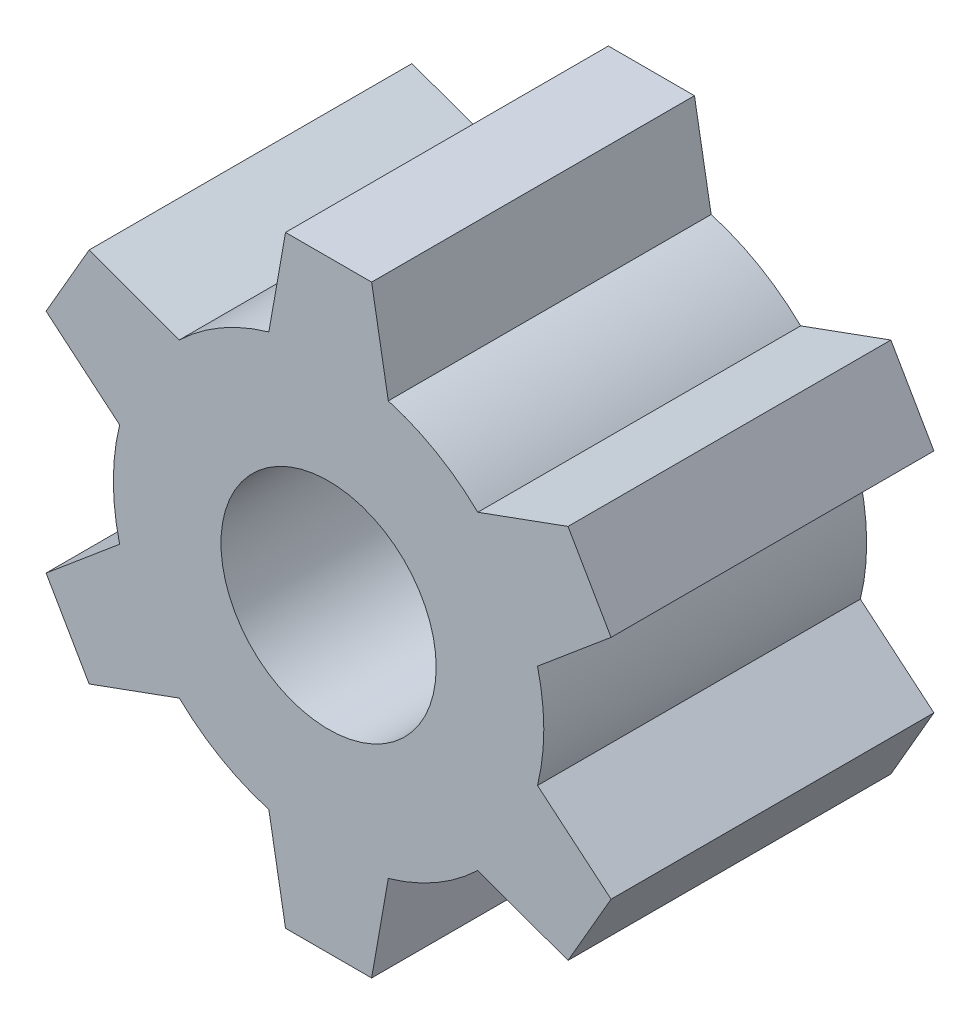
ISO-10303-21;
HEADER;
FILE_DESCRIPTION(('STEP AP214'),'2;1');
FILE_NAME('part.step','',(''),(''),'','','');
FILE_SCHEMA(('AUTOMOTIVE_DESIGN { 1 0 10303 214 1 1 1 1 }'));
ENDSEC;
DATA;
#1=APPLICATION_CONTEXT('core data for automotive mechanical design processes');
#2=APPLICATION_PROTOCOL_DEFINITION('international standard','automotive_design',2000,#1);
#3=PRODUCT_CONTEXT('',#1,'mechanical');
#4=PRODUCT('Part','Part','',(#3));
#5=PRODUCT_RELATED_PRODUCT_CATEGORY('part','',(#4));
#6=PRODUCT_DEFINITION_FORMATION('','',#4);
#7=PRODUCT_DEFINITION_CONTEXT('part definition',#1,'design');
#8=PRODUCT_DEFINITION('design','',#6,#7);
#9=PRODUCT_DEFINITION_SHAPE('','',#8);
#10=(LENGTH_UNIT() NAMED_UNIT(*) SI_UNIT(.MILLI.,.METRE.));
#11=(NAMED_UNIT(*) PLANE_ANGLE_UNIT() SI_UNIT($,.RADIAN.));
#12=(NAMED_UNIT(*) SI_UNIT($,.STERADIAN.) SOLID_ANGLE_UNIT());
#13=UNCERTAINTY_MEASURE_WITH_UNIT(LENGTH_MEASURE(1.E-05),#10,'distance_accuracy_value','');
#14=(GEOMETRIC_REPRESENTATION_CONTEXT(3) GLOBAL_UNCERTAINTY_ASSIGNED_CONTEXT((#13)) GLOBAL_UNIT_ASSIGNED_CONTEXT((#10,
#11,#12)) REPRESENTATION_CONTEXT('',''));
#15=CARTESIAN_POINT('',(0.,0.,0.));
#16=DIRECTION('',(0.,0.,1.));
#17=DIRECTION('',(1.,0.,0.));
#18=AXIS2_PLACEMENT_3D('',#15,#16,#17);
#19=CARTESIAN_POINT('',(0.,0.,7.5));
#20=DIRECTION('',(0.,0.,1.));
#21=DIRECTION('',(1.,0.,0.));
#22=AXIS2_PLACEMENT_3D('',#19,#20,#21);
#23=PLANE('',#22);
#24=DIRECTION('',(0.766102096423628,0.642718894895212,0.));
#25=VECTOR('',#24,1.);
#26=CARTESIAN_POINT('',(6.56217782649117,2.6339745962162,7.5));
#27=LINE('',#26,#25);
#28=CARTESIAN_POINT('',(4.85370252744986,1.20065472764819,7.5));
#29=VERTEX_POINT('',#28);
#30=CARTESIAN_POINT('',(6.56217782649117,2.6339745962162,7.5));
#31=VERTEX_POINT('',#30);
#32=EDGE_CURVE('E279',#29,#31,#27,.T.);
#33=ORIENTED_EDGE('',*,*,#32,.T.);
#34=DIRECTION('',(-0.499999999999999,0.866025403784439,0.));
#35=VECTOR('',#34,1.);
#36=CARTESIAN_POINT('',(5.56217782649126,4.36602540378491,7.5));
#37=LINE('',#36,#35);
#38=CARTESIAN_POINT('',(5.56217782649126,4.36602540378491,7.5));
#39=VERTEX_POINT('',#38);
#40=EDGE_CURVE('E147',#31,#39,#37,.T.);
#41=ORIENTED_EDGE('',*,*,#40,.T.);
#42=DIRECTION('',(-0.939661938683348,-0.342104429947715,0.));
#43=VECTOR('',#42,1.);
#44=CARTESIAN_POINT('',(5.56217782649126,4.36602540378491,7.5));
#45=LINE('',#44,#43);
#46=CARTESIAN_POINT('',(3.4666487590414,3.60310232736095,7.5));
#47=VERTEX_POINT('',#46);
#48=EDGE_CURVE('E342',#39,#47,#45,.T.);
#49=ORIENTED_EDGE('',*,*,#48,.T.);
#50=CARTESIAN_POINT('',(0.,0.,7.5));
#51=DIRECTION('',(0.,0.,1.));
#52=DIRECTION('',(1.,0.,0.));
#53=AXIS2_PLACEMENT_3D('',#50,#51,#52);
#54=CIRCLE('',#53,4.99999999999972);
#55=CARTESIAN_POINT('',(1.38705376840771,4.80375705500842,7.5));
#56=VERTEX_POINT('',#55);
#57=EDGE_CURVE('E361',#47,#56,#54,.T.);
#58=ORIENTED_EDGE('',*,*,#57,.T.);
#59=DIRECTION('',(-0.1735598422597,0.984823324842983,0.));
#60=VECTOR('',#59,1.);
#61=CARTESIAN_POINT('',(0.999999999999492,7.0000000000004,7.5));
#62=LINE('',#61,#60);
#63=CARTESIAN_POINT('',(0.999999999999492,7.0000000000004,7.5));
#64=VERTEX_POINT('',#63);
#65=EDGE_CURVE('E358',#56,#64,#62,.T.);
#66=ORIENTED_EDGE('',*,*,#65,.T.);
#67=DIRECTION('',(-1.,0.,0.));
#68=VECTOR('',#67,1.);
#69=CARTESIAN_POINT('',(-1.00000000000031,7.00000000000041,7.5));
#70=LINE('',#69,#68);
#71=CARTESIAN_POINT('',(-1.00000000000031,7.00000000000041,7.5));
#72=VERTEX_POINT('',#71);
#73=EDGE_CURVE('E360',#64,#72,#70,.T.);
#74=ORIENTED_EDGE('',*,*,#73,.T.);
#75=DIRECTION('',(-0.173559842259759,-0.984823324842973,0.));
#76=VECTOR('',#75,1.);
#77=CARTESIAN_POINT('',(-1.00000000000031,7.00000000000041,7.5));
#78=LINE('',#77,#76);
#79=CARTESIAN_POINT('',(-1.38705376840872,4.80375705500813,7.5));
#80=VERTEX_POINT('',#79);
#81=EDGE_CURVE('E363',#72,#80,#78,.T.);
#82=ORIENTED_EDGE('',*,*,#81,.T.);
#83=CARTESIAN_POINT('',(0.,0.,7.5));
#84=DIRECTION('',(0.,0.,1.));
#85=DIRECTION('',(1.,0.,0.));
#86=AXIS2_PLACEMENT_3D('',#83,#84,#85);
#87=CIRCLE('',#86,4.99999999999972);
#88=CARTESIAN_POINT('',(-3.46664875904215,3.60310232736022,7.5));
#89=VERTEX_POINT('',#88);
#90=EDGE_CURVE('E369',#80,#89,#87,.T.);
#91=ORIENTED_EDGE('',*,*,#90,.T.);
#92=DIRECTION('',(-0.939661938683328,0.34210442994777,0.));
#93=VECTOR('',#92,1.);
#94=CARTESIAN_POINT('',(-5.56217782649168,4.3660254037842,7.5));
#95=LINE('',#94,#93);
#96=CARTESIAN_POINT('',(-5.56217782649168,4.3660254037842,7.5));
#97=VERTEX_POINT('',#96);
#98=EDGE_CURVE('E371',#89,#97,#95,.T.);
#99=ORIENTED_EDGE('',*,*,#98,.T.);
#100=DIRECTION('',(-0.500000000000001,-0.866025403784438,0.));
#101=VECTOR('',#100,1.);
#102=CARTESIAN_POINT('',(-6.56217782649158,2.63397459621549,7.5));
#103=LINE('',#102,#101);
#104=CARTESIAN_POINT('',(-6.56217782649158,2.63397459621549,7.5));
#105=VERTEX_POINT('',#104);
#106=EDGE_CURVE('E373',#97,#105,#103,.T.);
#107=ORIENTED_EDGE('',*,*,#106,.T.);
#108=DIRECTION('',(0.76610209642359,-0.642718894895257,0.));
#109=VECTOR('',#108,1.);
#110=CARTESIAN_POINT('',(-6.56217782649158,2.63397459621549,7.5));
#111=LINE('',#110,#109);
#112=CARTESIAN_POINT('',(-4.85370252745012,1.20065472764717,7.5));
#113=VERTEX_POINT('',#112);
#114=EDGE_CURVE('E375',#105,#113,#111,.T.);
#115=ORIENTED_EDGE('',*,*,#114,.T.);
#116=CARTESIAN_POINT('',(0.,0.,7.5));
#117=DIRECTION('',(0.,0.,1.));
#118=DIRECTION('',(1.,0.,0.));
#119=AXIS2_PLACEMENT_3D('',#116,#117,#118);
#120=CIRCLE('',#119,4.99999999999972);
#121=CARTESIAN_POINT('',(-4.85370252744987,-1.20065472764819,7.5));
#122=VERTEX_POINT('',#121);
#123=EDGE_CURVE('E377',#113,#122,#120,.T.);
#124=ORIENTED_EDGE('',*,*,#123,.T.);
#125=DIRECTION('',(-0.766102096423627,-0.642718894895212,0.));
#126=VECTOR('',#125,1.);
#127=CARTESIAN_POINT('',(-6.56217782649117,-2.6339745962162,7.5));
#128=LINE('',#127,#126);
#129=CARTESIAN_POINT('',(-6.56217782649117,-2.6339745962162,7.5));
#130=VERTEX_POINT('',#129);
#131=EDGE_CURVE('E379',#122,#130,#128,.T.);
#132=ORIENTED_EDGE('',*,*,#131,.T.);
#133=DIRECTION('',(0.499999999999999,-0.866025403784439,0.));
#134=VECTOR('',#133,1.);
#135=CARTESIAN_POINT('',(-5.56217782649126,-4.36602540378492,7.5));
#136=LINE('',#135,#134);
#137=CARTESIAN_POINT('',(-5.56217782649126,-4.36602540378492,7.5));
#138=VERTEX_POINT('',#137);
#139=EDGE_CURVE('E381',#130,#138,#136,.T.);
#140=ORIENTED_EDGE('',*,*,#139,.T.);
#141=DIRECTION('',(0.939661938683348,0.342104429947715,0.));
#142=VECTOR('',#141,1.);
#143=CARTESIAN_POINT('',(-5.56217782649126,-4.36602540378492,7.5));
#144=LINE('',#143,#142);
#145=CARTESIAN_POINT('',(-3.4666487590414,-3.60310232736095,7.5));
#146=VERTEX_POINT('',#145);
#147=EDGE_CURVE('E383',#138,#146,#144,.T.);
#148=ORIENTED_EDGE('',*,*,#147,.T.);
#149=CARTESIAN_POINT('',(0.,0.,7.5));
#150=DIRECTION('',(0.,0.,1.));
#151=DIRECTION('',(1.,0.,0.));
#152=AXIS2_PLACEMENT_3D('',#149,#150,#151);
#153=CIRCLE('',#152,4.99999999999972);
#154=CARTESIAN_POINT('',(-1.38705376840772,-4.80375705500841,7.5));
#155=VERTEX_POINT('',#154);
#156=EDGE_CURVE('E385',#146,#155,#153,.T.);
#157=ORIENTED_EDGE('',*,*,#156,.T.);
#158=DIRECTION('',(0.1735598422597,-0.984823324842983,0.));
#159=VECTOR('',#158,1.);
#160=CARTESIAN_POINT('',(-0.999999999999493,-7.0000000000004,7.5));
#161=LINE('',#160,#159);
#162=CARTESIAN_POINT('',(-0.999999999999493,-7.0000000000004,7.5));
#163=VERTEX_POINT('',#162);
#164=EDGE_CURVE('E387',#155,#163,#161,.T.);
#165=ORIENTED_EDGE('',*,*,#164,.T.);
#166=DIRECTION('',(1.,0.,0.));
#167=VECTOR('',#166,1.);
#168=CARTESIAN_POINT('',(1.00000000000031,-7.00000000000041,7.5));
#169=LINE('',#168,#167);
#170=CARTESIAN_POINT('',(1.00000000000031,-7.00000000000041,7.5));
#171=VERTEX_POINT('',#170);
#172=EDGE_CURVE('E389',#163,#171,#169,.T.);
#173=ORIENTED_EDGE('',*,*,#172,.T.);
#174=DIRECTION('',(0.173559842259759,0.984823324842973,0.));
#175=VECTOR('',#174,1.);
#176=CARTESIAN_POINT('',(1.00000000000031,-7.00000000000041,7.5));
#177=LINE('',#176,#175);
#178=CARTESIAN_POINT('',(1.38705376840872,-4.80375705500812,7.5));
#179=VERTEX_POINT('',#178);
#180=EDGE_CURVE('E391',#171,#179,#177,.T.);
#181=ORIENTED_EDGE('',*,*,#180,.T.);
#182=CARTESIAN_POINT('',(0.,0.,7.5));
#183=DIRECTION('',(0.,0.,1.));
#184=DIRECTION('',(1.,0.,0.));
#185=AXIS2_PLACEMENT_3D('',#182,#183,#184);
#186=CIRCLE('',#185,4.99999999999972);
#187=CARTESIAN_POINT('',(3.46664875904215,-3.60310232736022,7.5));
#188=VERTEX_POINT('',#187);
#189=EDGE_CURVE('E393',#179,#188,#186,.T.);
#190=ORIENTED_EDGE('',*,*,#189,.T.);
#191=DIRECTION('',(0.939661938683328,-0.342104429947771,0.));
#192=VECTOR('',#191,1.);
#193=CARTESIAN_POINT('',(5.56217782649167,-4.3660254037842,7.5));
#194=LINE('',#193,#192);
#195=CARTESIAN_POINT('',(5.56217782649167,-4.3660254037842,7.5));
#196=VERTEX_POINT('',#195);
#197=EDGE_CURVE('E214',#188,#196,#194,.T.);
#198=ORIENTED_EDGE('',*,*,#197,.T.);
#199=DIRECTION('',(0.500000000000001,0.866025403784438,0.));
#200=VECTOR('',#199,1.);
#201=CARTESIAN_POINT('',(6.56217782649158,-2.63397459621549,7.5));
#202=LINE('',#201,#200);
#203=CARTESIAN_POINT('',(6.56217782649158,-2.63397459621549,7.5));
#204=VERTEX_POINT('',#203);
#205=EDGE_CURVE('E208',#196,#204,#202,.T.);
#206=ORIENTED_EDGE('',*,*,#205,.T.);
#207=DIRECTION('',(-0.766102096423589,0.642718894895258,0.));
#208=VECTOR('',#207,1.);
#209=CARTESIAN_POINT('',(6.56217782649158,-2.63397459621549,7.5));
#210=LINE('',#209,#208);
#211=CARTESIAN_POINT('',(4.85370252745012,-1.20065472764717,7.5));
#212=VERTEX_POINT('',#211);
#213=EDGE_CURVE('E212',#204,#212,#210,.T.);
#214=ORIENTED_EDGE('',*,*,#213,.T.);
#215=CARTESIAN_POINT('',(0.,0.,7.5));
#216=DIRECTION('',(0.,0.,1.));
#217=DIRECTION('',(1.,0.,0.));
#218=AXIS2_PLACEMENT_3D('',#215,#216,#217);
#219=CIRCLE('',#218,4.99999999999972);
#220=EDGE_CURVE('E56',#212,#29,#219,.T.);
#221=ORIENTED_EDGE('',*,*,#220,.T.);
#222=EDGE_LOOP('',(#33,#41,#49,#58,#66,#74,#82,#91,#99,#107,#115,#124,#132,#140,#148,#157,#165,
#173,#181,#190,#198,#206,#214,#221));
#223=FACE_BOUND('',#222,.T.);
#224=CARTESIAN_POINT('',(0.,0.,7.5));
#225=DIRECTION('',(0.,0.,1.));
#226=DIRECTION('',(1.,0.,0.));
#227=AXIS2_PLACEMENT_3D('',#224,#225,#226);
#228=CIRCLE('',#227,2.5);
#229=CARTESIAN_POINT('',(2.5,0.,7.5));
#230=VERTEX_POINT('',#229);
#231=EDGE_CURVE('E236',#230,#230,#228,.T.);
#232=ORIENTED_EDGE('',*,*,#231,.F.);
#233=EDGE_LOOP('',(#232));
#234=FACE_BOUND('',#233,.T.);
#235=ADVANCED_FACE('F39',(#223,#234),#23,.T.);
#236=CARTESIAN_POINT('',(0.,0.,0.));
#237=DIRECTION('',(0.,0.,1.));
#238=DIRECTION('',(1.,0.,0.));
#239=AXIS2_PLACEMENT_3D('',#236,#237,#238);
#240=PLANE('',#239);
#241=DIRECTION('',(0.766102096423628,0.642718894895212,0.));
#242=VECTOR('',#241,1.);
#243=CARTESIAN_POINT('',(6.56217782649117,2.6339745962162,0.));
#244=LINE('',#243,#242);
#245=CARTESIAN_POINT('',(4.85370252744986,1.20065472764819,0.));
#246=VERTEX_POINT('',#245);
#247=CARTESIAN_POINT('',(6.56217782649117,2.6339745962162,0.));
#248=VERTEX_POINT('',#247);
#249=EDGE_CURVE('E232',#246,#248,#244,.T.);
#250=ORIENTED_EDGE('',*,*,#249,.F.);
#251=CARTESIAN_POINT('',(0.,0.,0.));
#252=DIRECTION('',(0.,0.,1.));
#253=DIRECTION('',(1.,0.,0.));
#254=AXIS2_PLACEMENT_3D('',#251,#252,#253);
#255=CIRCLE('',#254,4.99999999999972);
#256=CARTESIAN_POINT('',(4.85370252745012,-1.20065472764717,0.));
#257=VERTEX_POINT('',#256);
#258=EDGE_CURVE('E139',#257,#246,#255,.T.);
#259=ORIENTED_EDGE('',*,*,#258,.F.);
#260=DIRECTION('',(-0.766102096423589,0.642718894895258,0.));
#261=VECTOR('',#260,1.);
#262=CARTESIAN_POINT('',(6.56217782649158,-2.63397459621549,0.));
#263=LINE('',#262,#261);
#264=CARTESIAN_POINT('',(6.56217782649158,-2.63397459621549,0.));
#265=VERTEX_POINT('',#264);
#266=EDGE_CURVE('E133',#265,#257,#263,.T.);
#267=ORIENTED_EDGE('',*,*,#266,.F.);
#268=DIRECTION('',(0.500000000000001,0.866025403784438,0.));
#269=VECTOR('',#268,1.);
#270=CARTESIAN_POINT('',(6.56217782649158,-2.63397459621549,0.));
#271=LINE('',#270,#269);
#272=CARTESIAN_POINT('',(5.56217782649167,-4.3660254037842,0.));
#273=VERTEX_POINT('',#272);
#274=EDGE_CURVE('E222',#273,#265,#271,.T.);
#275=ORIENTED_EDGE('',*,*,#274,.F.);
#276=DIRECTION('',(0.939661938683328,-0.342104429947771,0.));
#277=VECTOR('',#276,1.);
#278=CARTESIAN_POINT('',(5.56217782649167,-4.3660254037842,0.));
#279=LINE('',#278,#277);
#280=CARTESIAN_POINT('',(3.46664875904215,-3.60310232736022,0.));
#281=VERTEX_POINT('',#280);
#282=EDGE_CURVE('E274',#281,#273,#279,.T.);
#283=ORIENTED_EDGE('',*,*,#282,.F.);
#284=CARTESIAN_POINT('',(0.,0.,0.));
#285=DIRECTION('',(0.,0.,1.));
#286=DIRECTION('',(1.,0.,0.));
#287=AXIS2_PLACEMENT_3D('',#284,#285,#286);
#288=CIRCLE('',#287,4.99999999999972);
#289=CARTESIAN_POINT('',(1.38705376840872,-4.80375705500812,0.));
#290=VERTEX_POINT('',#289);
#291=EDGE_CURVE('E272',#290,#281,#288,.T.);
#292=ORIENTED_EDGE('',*,*,#291,.F.);
#293=DIRECTION('',(0.173559842259759,0.984823324842973,0.));
#294=VECTOR('',#293,1.);
#295=CARTESIAN_POINT('',(1.00000000000031,-7.00000000000041,0.));
#296=LINE('',#295,#294);
#297=CARTESIAN_POINT('',(1.00000000000031,-7.00000000000041,0.));
#298=VERTEX_POINT('',#297);
#299=EDGE_CURVE('E270',#298,#290,#296,.T.);
#300=ORIENTED_EDGE('',*,*,#299,.F.);
#301=DIRECTION('',(1.,0.,0.));
#302=VECTOR('',#301,1.);
#303=CARTESIAN_POINT('',(1.00000000000031,-7.00000000000041,0.));
#304=LINE('',#303,#302);
#305=CARTESIAN_POINT('',(-0.999999999999493,-7.0000000000004,0.));
#306=VERTEX_POINT('',#305);
#307=EDGE_CURVE('E268',#306,#298,#304,.T.);
#308=ORIENTED_EDGE('',*,*,#307,.F.);
#309=DIRECTION('',(0.1735598422597,-0.984823324842983,0.));
#310=VECTOR('',#309,1.);
#311=CARTESIAN_POINT('',(-0.999999999999493,-7.0000000000004,0.));
#312=LINE('',#311,#310);
#313=CARTESIAN_POINT('',(-1.38705376840772,-4.80375705500841,0.));
#314=VERTEX_POINT('',#313);
#315=EDGE_CURVE('E266',#314,#306,#312,.T.);
#316=ORIENTED_EDGE('',*,*,#315,.F.);
#317=CARTESIAN_POINT('',(0.,0.,0.));
#318=DIRECTION('',(0.,0.,1.));
#319=DIRECTION('',(1.,0.,0.));
#320=AXIS2_PLACEMENT_3D('',#317,#318,#319);
#321=CIRCLE('',#320,4.99999999999972);
#322=CARTESIAN_POINT('',(-3.4666487590414,-3.60310232736095,0.));
#323=VERTEX_POINT('',#322);
#324=EDGE_CURVE('E264',#323,#314,#321,.T.);
#325=ORIENTED_EDGE('',*,*,#324,.F.);
#326=DIRECTION('',(0.939661938683348,0.342104429947715,0.));
#327=VECTOR('',#326,1.);
#328=CARTESIAN_POINT('',(-5.56217782649126,-4.36602540378492,0.));
#329=LINE('',#328,#327);
#330=CARTESIAN_POINT('',(-5.56217782649126,-4.36602540378492,0.));
#331=VERTEX_POINT('',#330);
#332=EDGE_CURVE('E262',#331,#323,#329,.T.);
#333=ORIENTED_EDGE('',*,*,#332,.F.);
#334=DIRECTION('',(0.499999999999999,-0.866025403784439,0.));
#335=VECTOR('',#334,1.);
#336=CARTESIAN_POINT('',(-5.56217782649126,-4.36602540378492,0.));
#337=LINE('',#336,#335);
#338=CARTESIAN_POINT('',(-6.56217782649117,-2.6339745962162,0.));
#339=VERTEX_POINT('',#338);
#340=EDGE_CURVE('E260',#339,#331,#337,.T.);
#341=ORIENTED_EDGE('',*,*,#340,.F.);
#342=DIRECTION('',(-0.766102096423627,-0.642718894895212,0.));
#343=VECTOR('',#342,1.);
#344=CARTESIAN_POINT('',(-6.56217782649117,-2.6339745962162,0.));
#345=LINE('',#344,#343);
#346=CARTESIAN_POINT('',(-4.85370252744987,-1.20065472764819,0.));
#347=VERTEX_POINT('',#346);
#348=EDGE_CURVE('E258',#347,#339,#345,.T.);
#349=ORIENTED_EDGE('',*,*,#348,.F.);
#350=CARTESIAN_POINT('',(0.,0.,0.));
#351=DIRECTION('',(0.,0.,1.));
#352=DIRECTION('',(1.,0.,0.));
#353=AXIS2_PLACEMENT_3D('',#350,#351,#352);
#354=CIRCLE('',#353,4.99999999999972);
#355=CARTESIAN_POINT('',(-4.85370252745012,1.20065472764717,0.));
#356=VERTEX_POINT('',#355);
#357=EDGE_CURVE('E256',#356,#347,#354,.T.);
#358=ORIENTED_EDGE('',*,*,#357,.F.);
#359=DIRECTION('',(0.76610209642359,-0.642718894895257,0.));
#360=VECTOR('',#359,1.);
#361=CARTESIAN_POINT('',(-6.56217782649158,2.63397459621549,0.));
#362=LINE('',#361,#360);
#363=CARTESIAN_POINT('',(-6.56217782649158,2.63397459621549,0.));
#364=VERTEX_POINT('',#363);
#365=EDGE_CURVE('E254',#364,#356,#362,.T.);
#366=ORIENTED_EDGE('',*,*,#365,.F.);
#367=DIRECTION('',(-0.500000000000001,-0.866025403784438,0.));
#368=VECTOR('',#367,1.);
#369=CARTESIAN_POINT('',(-6.56217782649158,2.63397459621549,0.));
#370=LINE('',#369,#368);
#371=CARTESIAN_POINT('',(-5.56217782649168,4.3660254037842,0.));
#372=VERTEX_POINT('',#371);
#373=EDGE_CURVE('E252',#372,#364,#370,.T.);
#374=ORIENTED_EDGE('',*,*,#373,.F.);
#375=DIRECTION('',(-0.939661938683328,0.34210442994777,0.));
#376=VECTOR('',#375,1.);
#377=CARTESIAN_POINT('',(-5.56217782649168,4.3660254037842,0.));
#378=LINE('',#377,#376);
#379=CARTESIAN_POINT('',(-3.46664875904215,3.60310232736022,0.));
#380=VERTEX_POINT('',#379);
#381=EDGE_CURVE('E250',#380,#372,#378,.T.);
#382=ORIENTED_EDGE('',*,*,#381,.F.);
#383=CARTESIAN_POINT('',(0.,0.,0.));
#384=DIRECTION('',(0.,0.,1.));
#385=DIRECTION('',(1.,0.,0.));
#386=AXIS2_PLACEMENT_3D('',#383,#384,#385);
#387=CIRCLE('',#386,4.99999999999972);
#388=CARTESIAN_POINT('',(-1.38705376840872,4.80375705500813,0.));
#389=VERTEX_POINT('',#388);
#390=EDGE_CURVE('E248',#389,#380,#387,.T.);
#391=ORIENTED_EDGE('',*,*,#390,.F.);
#392=DIRECTION('',(-0.173559842259759,-0.984823324842973,0.));
#393=VECTOR('',#392,1.);
#394=CARTESIAN_POINT('',(-1.00000000000031,7.00000000000041,0.));
#395=LINE('',#394,#393);
#396=CARTESIAN_POINT('',(-1.00000000000031,7.00000000000041,0.));
#397=VERTEX_POINT('',#396);
#398=EDGE_CURVE('E246',#397,#389,#395,.T.);
#399=ORIENTED_EDGE('',*,*,#398,.F.);
#400=DIRECTION('',(-1.,0.,0.));
#401=VECTOR('',#400,1.);
#402=CARTESIAN_POINT('',(-1.00000000000031,7.00000000000041,0.));
#403=LINE('',#402,#401);
#404=CARTESIAN_POINT('',(0.999999999999492,7.0000000000004,0.));
#405=VERTEX_POINT('',#404);
#406=EDGE_CURVE('E244',#405,#397,#403,.T.);
#407=ORIENTED_EDGE('',*,*,#406,.F.);
#408=DIRECTION('',(-0.1735598422597,0.984823324842983,0.));
#409=VECTOR('',#408,1.);
#410=CARTESIAN_POINT('',(0.999999999999492,7.0000000000004,0.));
#411=LINE('',#410,#409);
#412=CARTESIAN_POINT('',(1.38705376840771,4.80375705500842,0.));
#413=VERTEX_POINT('',#412);
#414=EDGE_CURVE('E242',#413,#405,#411,.T.);
#415=ORIENTED_EDGE('',*,*,#414,.F.);
#416=CARTESIAN_POINT('',(0.,0.,0.));
#417=DIRECTION('',(0.,0.,1.));
#418=DIRECTION('',(1.,0.,0.));
#419=AXIS2_PLACEMENT_3D('',#416,#417,#418);
#420=CIRCLE('',#419,4.99999999999972);
#421=CARTESIAN_POINT('',(3.4666487590414,3.60310232736095,0.));
#422=VERTEX_POINT('',#421);
#423=EDGE_CURVE('E240',#422,#413,#420,.T.);
#424=ORIENTED_EDGE('',*,*,#423,.F.);
#425=DIRECTION('',(-0.939661938683348,-0.342104429947715,0.));
#426=VECTOR('',#425,1.);
#427=CARTESIAN_POINT('',(5.56217782649126,4.36602540378491,0.));
#428=LINE('',#427,#426);
#429=CARTESIAN_POINT('',(5.56217782649126,4.36602540378491,0.));
#430=VERTEX_POINT('',#429);
#431=EDGE_CURVE('E238',#430,#422,#428,.T.);
#432=ORIENTED_EDGE('',*,*,#431,.F.);
#433=DIRECTION('',(-0.499999999999999,0.866025403784439,0.));
#434=VECTOR('',#433,1.);
#435=CARTESIAN_POINT('',(5.56217782649126,4.36602540378491,0.));
#436=LINE('',#435,#434);
#437=EDGE_CURVE('E235',#248,#430,#436,.T.);
#438=ORIENTED_EDGE('',*,*,#437,.F.);
#439=EDGE_LOOP('',(#250,#259,#267,#275,#283,#292,#300,#308,#316,#325,#333,#341,#349,#358,#366,
#374,#382,#391,#399,#407,#415,#424,#432,#438));
#440=FACE_BOUND('',#439,.T.);
#441=CARTESIAN_POINT('',(0.,0.,0.));
#442=DIRECTION('',(0.,0.,1.));
#443=DIRECTION('',(1.,0.,0.));
#444=AXIS2_PLACEMENT_3D('',#441,#442,#443);
#445=CIRCLE('',#444,2.5);
#446=CARTESIAN_POINT('',(2.5,0.,0.));
#447=VERTEX_POINT('',#446);
#448=EDGE_CURVE('E696',#447,#447,#445,.T.);
#449=ORIENTED_EDGE('',*,*,#448,.T.);
#450=EDGE_LOOP('',(#449));
#451=FACE_BOUND('',#450,.T.);
#452=ADVANCED_FACE('F346',(#440,#451),#240,.F.);
#453=CARTESIAN_POINT('',(6.56217782649117,2.6339745962162,7.5));
#454=DIRECTION('',(-0.642718894895212,0.766102096423628,0.));
#455=DIRECTION('',(-0.766102096423628,-0.642718894895212,0.));
#456=AXIS2_PLACEMENT_3D('',#453,#454,#455);
#457=PLANE('',#456);
#458=ORIENTED_EDGE('',*,*,#249,.T.);
#459=DIRECTION('',(0.,0.,-1.));
#460=VECTOR('',#459,1.);
#461=CARTESIAN_POINT('',(6.56217782649117,2.6339745962162,7.5));
#462=LINE('',#461,#460);
#463=EDGE_CURVE('E11',#31,#248,#462,.T.);
#464=ORIENTED_EDGE('',*,*,#463,.F.);
#465=ORIENTED_EDGE('',*,*,#32,.F.);
#466=DIRECTION('',(0.,0.,-1.));
#467=VECTOR('',#466,1.);
#468=CARTESIAN_POINT('',(4.85370252744986,1.20065472764819,7.5));
#469=LINE('',#468,#467);
#470=EDGE_CURVE('E228',#29,#246,#469,.T.);
#471=ORIENTED_EDGE('',*,*,#470,.T.);
#472=EDGE_LOOP('',(#458,#464,#465,#471));
#473=FACE_BOUND('',#472,.T.);
#474=ADVANCED_FACE('F41',(#473),#457,.F.);
#475=CARTESIAN_POINT('',(5.56217782649126,4.36602540378491,7.5));
#476=DIRECTION('',(-0.866025403784439,-0.499999999999999,0.));
#477=DIRECTION('',(0.499999999999999,-0.866025403784439,0.));
#478=AXIS2_PLACEMENT_3D('',#475,#476,#477);
#479=PLANE('',#478);
#480=ORIENTED_EDGE('',*,*,#437,.T.);
#481=DIRECTION('',(0.,0.,-1.));
#482=VECTOR('',#481,1.);
#483=CARTESIAN_POINT('',(5.56217782649126,4.36602540378491,7.5));
#484=LINE('',#483,#482);
#485=EDGE_CURVE('E48',#39,#430,#484,.T.);
#486=ORIENTED_EDGE('',*,*,#485,.F.);
#487=ORIENTED_EDGE('',*,*,#40,.F.);
#488=ORIENTED_EDGE('',*,*,#463,.T.);
#489=EDGE_LOOP('',(#480,#486,#487,#488));
#490=FACE_BOUND('',#489,.T.);
#491=ADVANCED_FACE('F427',(#490),#479,.F.);
#492=CARTESIAN_POINT('',(5.56217782649126,4.36602540378491,7.5));
#493=DIRECTION('',(0.342104429947715,-0.939661938683348,0.));
#494=DIRECTION('',(0.939661938683348,0.342104429947715,0.));
#495=AXIS2_PLACEMENT_3D('',#492,#493,#494);
#496=PLANE('',#495);
#497=ORIENTED_EDGE('',*,*,#431,.T.);
#498=DIRECTION('',(0.,0.,-1.));
#499=VECTOR('',#498,1.);
#500=CARTESIAN_POINT('',(3.4666487590414,3.60310232736095,7.5));
#501=LINE('',#500,#499);
#502=EDGE_CURVE('E334',#47,#422,#501,.T.);
#503=ORIENTED_EDGE('',*,*,#502,.F.);
#504=ORIENTED_EDGE('',*,*,#48,.F.);
#505=ORIENTED_EDGE('',*,*,#485,.T.);
#506=EDGE_LOOP('',(#497,#503,#504,#505));
#507=FACE_BOUND('',#506,.T.);
#508=ADVANCED_FACE('F340',(#507),#496,.F.);
#509=CARTESIAN_POINT('',(0.,0.,7.5));
#510=DIRECTION('',(0.,0.,-1.));
#511=DIRECTION('',(-1.,0.,0.));
#512=AXIS2_PLACEMENT_3D('',#509,#510,#511);
#513=CYLINDRICAL_SURFACE('',#512,4.99999999999972);
#514=ORIENTED_EDGE('',*,*,#423,.T.);
#515=DIRECTION('',(0.,0.,-1.));
#516=VECTOR('',#515,1.);
#517=CARTESIAN_POINT('',(1.38705376840771,4.80375705500842,7.5));
#518=LINE('',#517,#516);
#519=EDGE_CURVE('E331',#56,#413,#518,.T.);
#520=ORIENTED_EDGE('',*,*,#519,.F.);
#521=ORIENTED_EDGE('',*,*,#57,.F.);
#522=ORIENTED_EDGE('',*,*,#502,.T.);
#523=EDGE_LOOP('',(#514,#520,#521,#522));
#524=FACE_BOUND('',#523,.T.);
#525=ADVANCED_FACE('F352',(#524),#513,.T.);
#526=CARTESIAN_POINT('',(0.999999999999492,7.0000000000004,7.5));
#527=DIRECTION('',(-0.984823324842983,-0.1735598422597,0.));
#528=DIRECTION('',(0.1735598422597,-0.984823324842983,0.));
#529=AXIS2_PLACEMENT_3D('',#526,#527,#528);
#530=PLANE('',#529);
#531=ORIENTED_EDGE('',*,*,#414,.T.);
#532=DIRECTION('',(0.,0.,-1.));
#533=VECTOR('',#532,1.);
#534=CARTESIAN_POINT('',(0.999999999999492,7.0000000000004,7.5));
#535=LINE('',#534,#533);
#536=EDGE_CURVE('E328',#64,#405,#535,.T.);
#537=ORIENTED_EDGE('',*,*,#536,.F.);
#538=ORIENTED_EDGE('',*,*,#65,.F.);
#539=ORIENTED_EDGE('',*,*,#519,.T.);
#540=EDGE_LOOP('',(#531,#537,#538,#539));
#541=FACE_BOUND('',#540,.T.);
#542=ADVANCED_FACE('F356',(#541),#530,.F.);
#543=CARTESIAN_POINT('',(-1.00000000000031,7.00000000000041,7.5));
#544=DIRECTION('',(0.,-1.,0.));
#545=DIRECTION('',(1.,0.,0.));
#546=AXIS2_PLACEMENT_3D('',#543,#544,#545);
#547=PLANE('',#546);
#548=ORIENTED_EDGE('',*,*,#406,.T.);
#549=DIRECTION('',(0.,0.,-1.));
#550=VECTOR('',#549,1.);
#551=CARTESIAN_POINT('',(-1.00000000000031,7.00000000000041,7.5));
#552=LINE('',#551,#550);
#553=EDGE_CURVE('E325',#72,#397,#552,.T.);
#554=ORIENTED_EDGE('',*,*,#553,.F.);
#555=ORIENTED_EDGE('',*,*,#73,.F.);
#556=ORIENTED_EDGE('',*,*,#536,.T.);
#557=EDGE_LOOP('',(#548,#554,#555,#556));
#558=FACE_BOUND('',#557,.T.);
#559=ADVANCED_FACE('F440',(#558),#547,.F.);
#560=CARTESIAN_POINT('',(-1.00000000000031,7.00000000000041,7.5));
#561=DIRECTION('',(0.984823324842973,-0.173559842259759,0.));
#562=DIRECTION('',(0.173559842259759,0.984823324842973,0.));
#563=AXIS2_PLACEMENT_3D('',#560,#561,#562);
#564=PLANE('',#563);
#565=ORIENTED_EDGE('',*,*,#398,.T.);
#566=DIRECTION('',(0.,0.,-1.));
#567=VECTOR('',#566,1.);
#568=CARTESIAN_POINT('',(-1.38705376840872,4.80375705500813,7.5));
#569=LINE('',#568,#567);
#570=EDGE_CURVE('E322',#80,#389,#569,.T.);
#571=ORIENTED_EDGE('',*,*,#570,.F.);
#572=ORIENTED_EDGE('',*,*,#81,.F.);
#573=ORIENTED_EDGE('',*,*,#553,.T.);
#574=EDGE_LOOP('',(#565,#571,#572,#573));
#575=FACE_BOUND('',#574,.T.);
#576=ADVANCED_FACE('F443',(#575),#564,.F.);
#577=CARTESIAN_POINT('',(0.,0.,7.5));
#578=DIRECTION('',(0.,0.,-1.));
#579=DIRECTION('',(-1.,0.,0.));
#580=AXIS2_PLACEMENT_3D('',#577,#578,#579);
#581=CYLINDRICAL_SURFACE('',#580,4.99999999999972);
#582=ORIENTED_EDGE('',*,*,#390,.T.);
#583=DIRECTION('',(0.,0.,-1.));
#584=VECTOR('',#583,1.);
#585=CARTESIAN_POINT('',(-3.46664875904215,3.60310232736022,7.5));
#586=LINE('',#585,#584);
#587=EDGE_CURVE('E319',#89,#380,#586,.T.);
#588=ORIENTED_EDGE('',*,*,#587,.F.);
#589=ORIENTED_EDGE('',*,*,#90,.F.);
#590=ORIENTED_EDGE('',*,*,#570,.T.);
#591=EDGE_LOOP('',(#582,#588,#589,#590));
#592=FACE_BOUND('',#591,.T.);
#593=ADVANCED_FACE('F447',(#592),#581,.T.);
#594=CARTESIAN_POINT('',(-5.56217782649168,4.3660254037842,7.5));
#595=DIRECTION('',(-0.34210442994777,-0.939661938683328,0.));
#596=DIRECTION('',(0.939661938683329,-0.34210442994777,0.));
#597=AXIS2_PLACEMENT_3D('',#594,#595,#596);
#598=PLANE('',#597);
#599=ORIENTED_EDGE('',*,*,#381,.T.);
#600=DIRECTION('',(0.,0.,-1.));
#601=VECTOR('',#600,1.);
#602=CARTESIAN_POINT('',(-5.56217782649168,4.3660254037842,7.5));
#603=LINE('',#602,#601);
#604=EDGE_CURVE('E316',#97,#372,#603,.T.);
#605=ORIENTED_EDGE('',*,*,#604,.F.);
#606=ORIENTED_EDGE('',*,*,#98,.F.);
#607=ORIENTED_EDGE('',*,*,#587,.T.);
#608=EDGE_LOOP('',(#599,#605,#606,#607));
#609=FACE_BOUND('',#608,.T.);
#610=ADVANCED_FACE('F451',(#609),#598,.F.);
#611=CARTESIAN_POINT('',(-6.56217782649158,2.63397459621549,7.5));
#612=DIRECTION('',(0.866025403784438,-0.500000000000001,0.));
#613=DIRECTION('',(0.500000000000001,0.866025403784438,0.));
#614=AXIS2_PLACEMENT_3D('',#611,#612,#613);
#615=PLANE('',#614);
#616=ORIENTED_EDGE('',*,*,#373,.T.);
#617=DIRECTION('',(0.,0.,-1.));
#618=VECTOR('',#617,1.);
#619=CARTESIAN_POINT('',(-6.56217782649158,2.63397459621549,7.5));
#620=LINE('',#619,#618);
#621=EDGE_CURVE('E313',#105,#364,#620,.T.);
#622=ORIENTED_EDGE('',*,*,#621,.F.);
#623=ORIENTED_EDGE('',*,*,#106,.F.);
#624=ORIENTED_EDGE('',*,*,#604,.T.);
#625=EDGE_LOOP('',(#616,#622,#623,#624));
#626=FACE_BOUND('',#625,.T.);
#627=ADVANCED_FACE('F455',(#626),#615,.F.);
#628=CARTESIAN_POINT('',(-6.56217782649158,2.63397459621549,7.5));
#629=DIRECTION('',(0.642718894895257,0.76610209642359,0.));
#630=DIRECTION('',(-0.76610209642359,0.642718894895257,0.));
#631=AXIS2_PLACEMENT_3D('',#628,#629,#630);
#632=PLANE('',#631);
#633=ORIENTED_EDGE('',*,*,#365,.T.);
#634=DIRECTION('',(0.,0.,-1.));
#635=VECTOR('',#634,1.);
#636=CARTESIAN_POINT('',(-4.85370252745012,1.20065472764717,7.5));
#637=LINE('',#636,#635);
#638=EDGE_CURVE('E310',#113,#356,#637,.T.);
#639=ORIENTED_EDGE('',*,*,#638,.F.);
#640=ORIENTED_EDGE('',*,*,#114,.F.);
#641=ORIENTED_EDGE('',*,*,#621,.T.);
#642=EDGE_LOOP('',(#633,#639,#640,#641));
#643=FACE_BOUND('',#642,.T.);
#644=ADVANCED_FACE('F459',(#643),#632,.F.);
#645=CARTESIAN_POINT('',(0.,0.,7.5));
#646=DIRECTION('',(0.,0.,-1.));
#647=DIRECTION('',(-1.,0.,0.));
#648=AXIS2_PLACEMENT_3D('',#645,#646,#647);
#649=CYLINDRICAL_SURFACE('',#648,4.99999999999972);
#650=ORIENTED_EDGE('',*,*,#357,.T.);
#651=DIRECTION('',(0.,0.,-1.));
#652=VECTOR('',#651,1.);
#653=CARTESIAN_POINT('',(-4.85370252744987,-1.20065472764819,7.5));
#654=LINE('',#653,#652);
#655=EDGE_CURVE('E307',#122,#347,#654,.T.);
#656=ORIENTED_EDGE('',*,*,#655,.F.);
#657=ORIENTED_EDGE('',*,*,#123,.F.);
#658=ORIENTED_EDGE('',*,*,#638,.T.);
#659=EDGE_LOOP('',(#650,#656,#657,#658));
#660=FACE_BOUND('',#659,.T.);
#661=ADVANCED_FACE('F463',(#660),#649,.T.);
#662=CARTESIAN_POINT('',(-6.56217782649117,-2.6339745962162,7.5));
#663=DIRECTION('',(0.642718894895212,-0.766102096423627,0.));
#664=DIRECTION('',(0.766102096423627,0.642718894895212,0.));
#665=AXIS2_PLACEMENT_3D('',#662,#663,#664);
#666=PLANE('',#665);
#667=ORIENTED_EDGE('',*,*,#348,.T.);
#668=DIRECTION('',(0.,0.,-1.));
#669=VECTOR('',#668,1.);
#670=CARTESIAN_POINT('',(-6.56217782649117,-2.6339745962162,7.5));
#671=LINE('',#670,#669);
#672=EDGE_CURVE('E304',#130,#339,#671,.T.);
#673=ORIENTED_EDGE('',*,*,#672,.F.);
#674=ORIENTED_EDGE('',*,*,#131,.F.);
#675=ORIENTED_EDGE('',*,*,#655,.T.);
#676=EDGE_LOOP('',(#667,#673,#674,#675));
#677=FACE_BOUND('',#676,.T.);
#678=ADVANCED_FACE('F467',(#677),#666,.F.);
#679=CARTESIAN_POINT('',(-5.56217782649126,-4.36602540378492,7.5));
#680=DIRECTION('',(0.866025403784439,0.499999999999999,0.));
#681=DIRECTION('',(-0.499999999999999,0.866025403784439,0.));
#682=AXIS2_PLACEMENT_3D('',#679,#680,#681);
#683=PLANE('',#682);
#684=ORIENTED_EDGE('',*,*,#340,.T.);
#685=DIRECTION('',(0.,0.,-1.));
#686=VECTOR('',#685,1.);
#687=CARTESIAN_POINT('',(-5.56217782649126,-4.36602540378492,7.5));
#688=LINE('',#687,#686);
#689=EDGE_CURVE('E301',#138,#331,#688,.T.);
#690=ORIENTED_EDGE('',*,*,#689,.F.);
#691=ORIENTED_EDGE('',*,*,#139,.F.);
#692=ORIENTED_EDGE('',*,*,#672,.T.);
#693=EDGE_LOOP('',(#684,#690,#691,#692));
#694=FACE_BOUND('',#693,.T.);
#695=ADVANCED_FACE('F471',(#694),#683,.F.);
#696=CARTESIAN_POINT('',(-5.56217782649126,-4.36602540378492,7.5));
#697=DIRECTION('',(-0.342104429947715,0.939661938683348,0.));
#698=DIRECTION('',(-0.939661938683349,-0.342104429947715,0.));
#699=AXIS2_PLACEMENT_3D('',#696,#697,#698);
#700=PLANE('',#699);
#701=ORIENTED_EDGE('',*,*,#332,.T.);
#702=DIRECTION('',(0.,0.,-1.));
#703=VECTOR('',#702,1.);
#704=CARTESIAN_POINT('',(-3.4666487590414,-3.60310232736095,7.5));
#705=LINE('',#704,#703);
#706=EDGE_CURVE('E298',#146,#323,#705,.T.);
#707=ORIENTED_EDGE('',*,*,#706,.F.);
#708=ORIENTED_EDGE('',*,*,#147,.F.);
#709=ORIENTED_EDGE('',*,*,#689,.T.);
#710=EDGE_LOOP('',(#701,#707,#708,#709));
#711=FACE_BOUND('',#710,.T.);
#712=ADVANCED_FACE('F475',(#711),#700,.F.);
#713=CARTESIAN_POINT('',(0.,0.,7.5));
#714=DIRECTION('',(0.,0.,-1.));
#715=DIRECTION('',(-1.,0.,0.));
#716=AXIS2_PLACEMENT_3D('',#713,#714,#715);
#717=CYLINDRICAL_SURFACE('',#716,4.99999999999972);
#718=ORIENTED_EDGE('',*,*,#324,.T.);
#719=DIRECTION('',(0.,0.,-1.));
#720=VECTOR('',#719,1.);
#721=CARTESIAN_POINT('',(-1.38705376840772,-4.80375705500841,7.5));
#722=LINE('',#721,#720);
#723=EDGE_CURVE('E295',#155,#314,#722,.T.);
#724=ORIENTED_EDGE('',*,*,#723,.F.);
#725=ORIENTED_EDGE('',*,*,#156,.F.);
#726=ORIENTED_EDGE('',*,*,#706,.T.);
#727=EDGE_LOOP('',(#718,#724,#725,#726));
#728=FACE_BOUND('',#727,.T.);
#729=ADVANCED_FACE('F479',(#728),#717,.T.);
#730=CARTESIAN_POINT('',(-0.999999999999493,-7.0000000000004,7.5));
#731=DIRECTION('',(0.984823324842983,0.173559842259701,0.));
#732=DIRECTION('',(-0.173559842259701,0.984823324842983,0.));
#733=AXIS2_PLACEMENT_3D('',#730,#731,#732);
#734=PLANE('',#733);
#735=ORIENTED_EDGE('',*,*,#315,.T.);
#736=DIRECTION('',(0.,0.,-1.));
#737=VECTOR('',#736,1.);
#738=CARTESIAN_POINT('',(-0.999999999999493,-7.0000000000004,7.5));
#739=LINE('',#738,#737);
#740=EDGE_CURVE('E292',#163,#306,#739,.T.);
#741=ORIENTED_EDGE('',*,*,#740,.F.);
#742=ORIENTED_EDGE('',*,*,#164,.F.);
#743=ORIENTED_EDGE('',*,*,#723,.T.);
#744=EDGE_LOOP('',(#735,#741,#742,#743));
#745=FACE_BOUND('',#744,.T.);
#746=ADVANCED_FACE('F483',(#745),#734,.F.);
#747=CARTESIAN_POINT('',(1.00000000000031,-7.00000000000041,7.5));
#748=DIRECTION('',(0.,1.,0.));
#749=DIRECTION('',(-1.,0.,0.));
#750=AXIS2_PLACEMENT_3D('',#747,#748,#749);
#751=PLANE('',#750);
#752=ORIENTED_EDGE('',*,*,#307,.T.);
#753=DIRECTION('',(0.,0.,-1.));
#754=VECTOR('',#753,1.);
#755=CARTESIAN_POINT('',(1.00000000000031,-7.00000000000041,7.5));
#756=LINE('',#755,#754);
#757=EDGE_CURVE('E289',#171,#298,#756,.T.);
#758=ORIENTED_EDGE('',*,*,#757,.F.);
#759=ORIENTED_EDGE('',*,*,#172,.F.);
#760=ORIENTED_EDGE('',*,*,#740,.T.);
#761=EDGE_LOOP('',(#752,#758,#759,#760));
#762=FACE_BOUND('',#761,.T.);
#763=ADVANCED_FACE('F487',(#762),#751,.F.);
#764=CARTESIAN_POINT('',(1.00000000000031,-7.00000000000041,7.5));
#765=DIRECTION('',(-0.984823324842973,0.173559842259759,0.));
#766=DIRECTION('',(-0.173559842259759,-0.984823324842973,0.));
#767=AXIS2_PLACEMENT_3D('',#764,#765,#766);
#768=PLANE('',#767);
#769=ORIENTED_EDGE('',*,*,#299,.T.);
#770=DIRECTION('',(0.,0.,-1.));
#771=VECTOR('',#770,1.);
#772=CARTESIAN_POINT('',(1.38705376840872,-4.80375705500812,7.5));
#773=LINE('',#772,#771);
#774=EDGE_CURVE('E286',#179,#290,#773,.T.);
#775=ORIENTED_EDGE('',*,*,#774,.F.);
#776=ORIENTED_EDGE('',*,*,#180,.F.);
#777=ORIENTED_EDGE('',*,*,#757,.T.);
#778=EDGE_LOOP('',(#769,#775,#776,#777));
#779=FACE_BOUND('',#778,.T.);
#780=ADVANCED_FACE('F491',(#779),#768,.F.);
#781=CARTESIAN_POINT('',(0.,0.,7.5));
#782=DIRECTION('',(0.,0.,-1.));
#783=DIRECTION('',(-1.,0.,0.));
#784=AXIS2_PLACEMENT_3D('',#781,#782,#783);
#785=CYLINDRICAL_SURFACE('',#784,4.99999999999972);
#786=ORIENTED_EDGE('',*,*,#291,.T.);
#787=DIRECTION('',(0.,0.,-1.));
#788=VECTOR('',#787,1.);
#789=CARTESIAN_POINT('',(3.46664875904215,-3.60310232736022,7.5));
#790=LINE('',#789,#788);
#791=EDGE_CURVE('E283',#188,#281,#790,.T.);
#792=ORIENTED_EDGE('',*,*,#791,.F.);
#793=ORIENTED_EDGE('',*,*,#189,.F.);
#794=ORIENTED_EDGE('',*,*,#774,.T.);
#795=EDGE_LOOP('',(#786,#792,#793,#794));
#796=FACE_BOUND('',#795,.T.);
#797=ADVANCED_FACE('F399',(#796),#785,.T.);
#798=CARTESIAN_POINT('',(5.56217782649167,-4.3660254037842,7.5));
#799=DIRECTION('',(0.342104429947771,0.939661938683328,0.));
#800=DIRECTION('',(-0.939661938683328,0.342104429947771,0.));
#801=AXIS2_PLACEMENT_3D('',#798,#799,#800);
#802=PLANE('',#801);
#803=ORIENTED_EDGE('',*,*,#282,.T.);
#804=DIRECTION('',(0.,0.,-1.));
#805=VECTOR('',#804,1.);
#806=CARTESIAN_POINT('',(5.56217782649167,-4.3660254037842,7.5));
#807=LINE('',#806,#805);
#808=EDGE_CURVE('E223',#196,#273,#807,.T.);
#809=ORIENTED_EDGE('',*,*,#808,.F.);
#810=ORIENTED_EDGE('',*,*,#197,.F.);
#811=ORIENTED_EDGE('',*,*,#791,.T.);
#812=EDGE_LOOP('',(#803,#809,#810,#811));
#813=FACE_BOUND('',#812,.T.);
#814=ADVANCED_FACE('F403',(#813),#802,.F.);
#815=CARTESIAN_POINT('',(6.56217782649158,-2.63397459621549,7.5));
#816=DIRECTION('',(-0.866025403784438,0.500000000000001,0.));
#817=DIRECTION('',(-0.500000000000001,-0.866025403784438,0.));
#818=AXIS2_PLACEMENT_3D('',#815,#816,#817);
#819=PLANE('',#818);
#820=ORIENTED_EDGE('',*,*,#274,.T.);
#821=DIRECTION('',(0.,0.,-1.));
#822=VECTOR('',#821,1.);
#823=CARTESIAN_POINT('',(6.56217782649158,-2.63397459621549,7.5));
#824=LINE('',#823,#822);
#825=EDGE_CURVE('E219',#204,#265,#824,.T.);
#826=ORIENTED_EDGE('',*,*,#825,.F.);
#827=ORIENTED_EDGE('',*,*,#205,.F.);
#828=ORIENTED_EDGE('',*,*,#808,.T.);
#829=EDGE_LOOP('',(#820,#826,#827,#828));
#830=FACE_BOUND('',#829,.T.);
#831=ADVANCED_FACE('F220',(#830),#819,.F.);
#832=CARTESIAN_POINT('',(6.56217782649158,-2.63397459621549,7.5));
#833=DIRECTION('',(-0.642718894895258,-0.766102096423589,0.));
#834=DIRECTION('',(0.766102096423589,-0.642718894895258,0.));
#835=AXIS2_PLACEMENT_3D('',#832,#833,#834);
#836=PLANE('',#835);
#837=ORIENTED_EDGE('',*,*,#266,.T.);
#838=DIRECTION('',(0.,0.,-1.));
#839=VECTOR('',#838,1.);
#840=CARTESIAN_POINT('',(4.85370252745012,-1.20065472764717,7.5));
#841=LINE('',#840,#839);
#842=EDGE_CURVE('E224',#212,#257,#841,.T.);
#843=ORIENTED_EDGE('',*,*,#842,.F.);
#844=ORIENTED_EDGE('',*,*,#213,.F.);
#845=ORIENTED_EDGE('',*,*,#825,.T.);
#846=EDGE_LOOP('',(#837,#843,#844,#845));
#847=FACE_BOUND('',#846,.T.);
#848=ADVANCED_FACE('F226',(#847),#836,.F.);
#849=CARTESIAN_POINT('',(0.,0.,7.5));
#850=DIRECTION('',(0.,0.,-1.));
#851=DIRECTION('',(-1.,0.,0.));
#852=AXIS2_PLACEMENT_3D('',#849,#850,#851);
#853=CYLINDRICAL_SURFACE('',#852,4.99999999999972);
#854=ORIENTED_EDGE('',*,*,#258,.T.);
#855=ORIENTED_EDGE('',*,*,#470,.F.);
#856=ORIENTED_EDGE('',*,*,#220,.F.);
#857=ORIENTED_EDGE('',*,*,#842,.T.);
#858=EDGE_LOOP('',(#854,#855,#856,#857));
#859=FACE_BOUND('',#858,.T.);
#860=ADVANCED_FACE('F407',(#859),#853,.T.);
#861=CARTESIAN_POINT('',(0.,0.,7.5));
#862=DIRECTION('',(0.,0.,-1.));
#863=DIRECTION('',(-1.,0.,0.));
#864=AXIS2_PLACEMENT_3D('',#861,#862,#863);
#865=CYLINDRICAL_SURFACE('',#864,2.5);
#866=ORIENTED_EDGE('',*,*,#231,.T.);
#867=EDGE_LOOP('',(#866));
#868=FACE_BOUND('',#867,.T.);
#869=ORIENTED_EDGE('',*,*,#448,.F.);
#870=EDGE_LOOP('',(#869));
#871=FACE_BOUND('',#870,.T.);
#872=ADVANCED_FACE('F409',(#868,#871),#865,.F.);
#873=CLOSED_SHELL('',(#235,#452,#474,#491,#508,#525,#542,#559,#576,#593,#610,#627,#644,#661,
#678,#695,#712,#729,#746,#763,#780,#797,#814,#831,#848,#860,#872));
#874=MANIFOLD_SOLID_BREP('B2',#873);
#875=ADVANCED_BREP_SHAPE_REPRESENTATION('',(#18,#874),#14);
#876=SHAPE_DEFINITION_REPRESENTATION(#9,#875);
ENDSEC;
END-ISO-10303-21;
